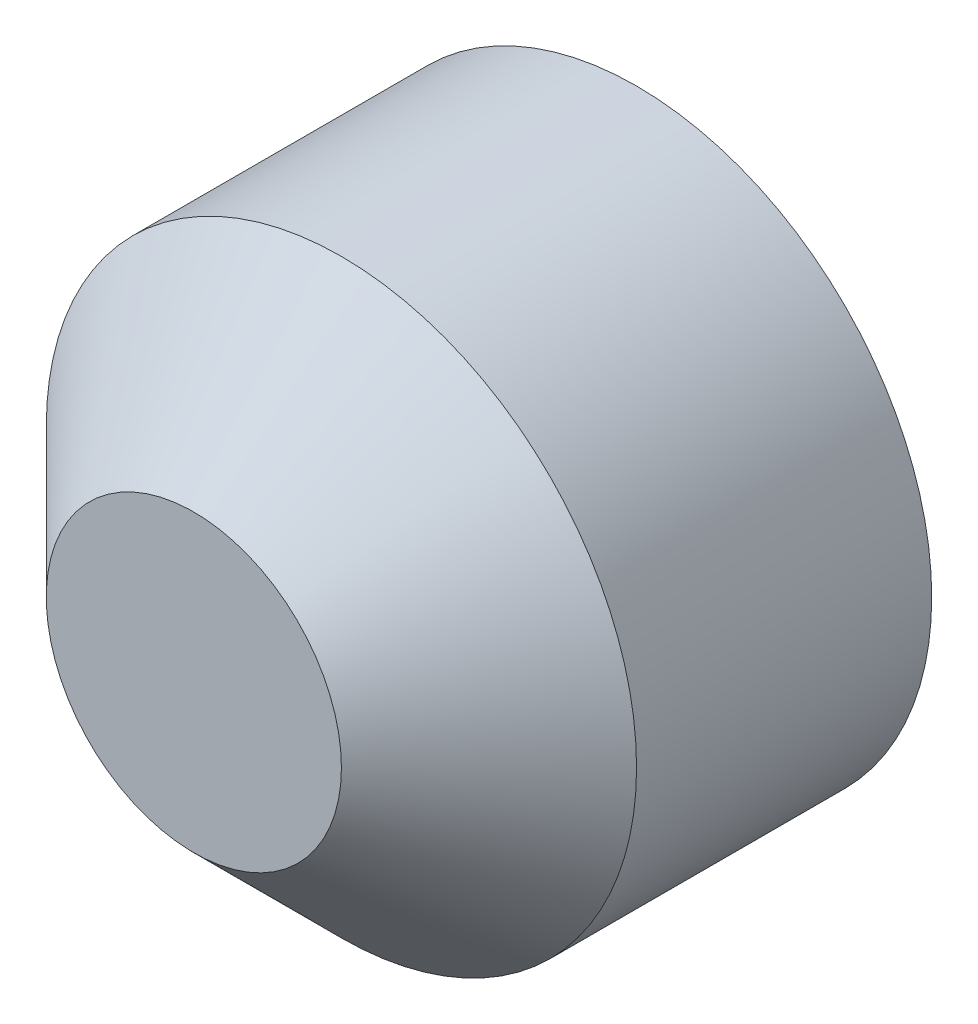
ISO-10303-21;
HEADER;
FILE_DESCRIPTION(('STEP AP214'),'2;1');
FILE_NAME('part.step','',(''),(''),'','','');
FILE_SCHEMA(('AUTOMOTIVE_DESIGN { 1 0 10303 214 1 1 1 1 }'));
ENDSEC;
DATA;
#1=APPLICATION_CONTEXT('core data for automotive mechanical design processes');
#2=APPLICATION_PROTOCOL_DEFINITION('international standard','automotive_design',2000,#1);
#3=PRODUCT_CONTEXT('',#1,'mechanical');
#4=PRODUCT('Part','Part','',(#3));
#5=PRODUCT_RELATED_PRODUCT_CATEGORY('part','',(#4));
#6=PRODUCT_DEFINITION_FORMATION('','',#4);
#7=PRODUCT_DEFINITION_CONTEXT('part definition',#1,'design');
#8=PRODUCT_DEFINITION('design','',#6,#7);
#9=PRODUCT_DEFINITION_SHAPE('','',#8);
#10=(LENGTH_UNIT() NAMED_UNIT(*) SI_UNIT(.MILLI.,.METRE.));
#11=(NAMED_UNIT(*) PLANE_ANGLE_UNIT() SI_UNIT($,.RADIAN.));
#12=(NAMED_UNIT(*) SI_UNIT($,.STERADIAN.) SOLID_ANGLE_UNIT());
#13=UNCERTAINTY_MEASURE_WITH_UNIT(LENGTH_MEASURE(1.E-05),#10,'distance_accuracy_value','');
#14=(GEOMETRIC_REPRESENTATION_CONTEXT(3) GLOBAL_UNCERTAINTY_ASSIGNED_CONTEXT((#13)) GLOBAL_UNIT_ASSIGNED_CONTEXT((#10,
#11,#12)) REPRESENTATION_CONTEXT('',''));
#15=CARTESIAN_POINT('',(0.,0.,0.));
#16=DIRECTION('',(0.,0.,1.));
#17=DIRECTION('',(1.,0.,0.));
#18=AXIS2_PLACEMENT_3D('',#15,#16,#17);
#19=CARTESIAN_POINT('',(0.,0.,0.));
#20=DIRECTION('',(0.,0.,1.));
#21=DIRECTION('',(1.,0.,0.));
#22=AXIS2_PLACEMENT_3D('',#19,#20,#21);
#23=PLANE('',#22);
#24=CARTESIAN_POINT('',(0.,0.,0.));
#25=DIRECTION('',(0.,0.,1.));
#26=DIRECTION('',(1.,0.,0.));
#27=AXIS2_PLACEMENT_3D('',#24,#25,#26);
#28=CIRCLE('',#27,100.);
#29=CARTESIAN_POINT('',(100.,0.,0.));
#30=VERTEX_POINT('',#29);
#31=EDGE_CURVE('E10',#30,#30,#28,.T.);
#32=ORIENTED_EDGE('',*,*,#31,.F.);
#33=EDGE_LOOP('',(#32));
#34=FACE_BOUND('',#33,.T.);
#35=ADVANCED_FACE('F34',(#34),#23,.F.);
#36=CARTESIAN_POINT('',(0.,0.,150.));
#37=DIRECTION('',(0.,0.,1.));
#38=DIRECTION('',(1.,0.,0.));
#39=AXIS2_PLACEMENT_3D('',#36,#37,#38);
#40=CYLINDRICAL_SURFACE('',#39,100.);
#41=CARTESIAN_POINT('',(0.,0.,100.));
#42=DIRECTION('',(0.,0.,1.));
#43=DIRECTION('',(1.,0.,0.));
#44=AXIS2_PLACEMENT_3D('',#41,#42,#43);
#45=CIRCLE('',#44,100.);
#46=CARTESIAN_POINT('',(100.,0.,100.));
#47=VERTEX_POINT('',#46);
#48=EDGE_CURVE('E40',#47,#47,#45,.T.);
#49=ORIENTED_EDGE('',*,*,#48,.F.);
#50=EDGE_LOOP('',(#49));
#51=FACE_BOUND('',#50,.T.);
#52=ORIENTED_EDGE('',*,*,#31,.T.);
#53=EDGE_LOOP('',(#52));
#54=FACE_BOUND('',#53,.T.);
#55=ADVANCED_FACE('F55',(#51,#54),#40,.T.);
#56=CARTESIAN_POINT('',(0.,0.,100.));
#57=DIRECTION('',(0.,0.,-1.));
#58=DIRECTION('',(-1.,0.,0.));
#59=AXIS2_PLACEMENT_3D('',#56,#57,#58);
#60=CONICAL_SURFACE('',#59,100.,0.785398163397451);
#61=CARTESIAN_POINT('',(0.,0.,150.));
#62=DIRECTION('',(0.,0.,1.));
#63=DIRECTION('',(1.,0.,0.));
#64=AXIS2_PLACEMENT_3D('',#61,#62,#63);
#65=CIRCLE('',#64,49.9999999999998);
#66=CARTESIAN_POINT('',(49.9999999999998,0.,150.));
#67=VERTEX_POINT('',#66);
#68=EDGE_CURVE('E44',#67,#67,#65,.T.);
#69=ORIENTED_EDGE('',*,*,#68,.F.);
#70=EDGE_LOOP('',(#69));
#71=FACE_BOUND('',#70,.T.);
#72=ORIENTED_EDGE('',*,*,#48,.T.);
#73=EDGE_LOOP('',(#72));
#74=FACE_BOUND('',#73,.T.);
#75=ADVANCED_FACE('F53',(#71,#74),#60,.T.);
#76=CARTESIAN_POINT('',(0.,49.9999999999998,150.));
#77=DIRECTION('',(0.,0.,-1.));
#78=DIRECTION('',(-1.,0.,0.));
#79=AXIS2_PLACEMENT_3D('',#76,#77,#78);
#80=PLANE('',#79);
#81=ORIENTED_EDGE('',*,*,#68,.T.);
#82=EDGE_LOOP('',(#81));
#83=FACE_BOUND('',#82,.T.);
#84=ADVANCED_FACE('F51',(#83),#80,.F.);
#85=CLOSED_SHELL('',(#35,#55,#75,#84));
#86=MANIFOLD_SOLID_BREP('B2',#85);
#87=ADVANCED_BREP_SHAPE_REPRESENTATION('',(#18,#86),#14);
#88=SHAPE_DEFINITION_REPRESENTATION(#9,#87);
ENDSEC;
END-ISO-10303-21;
